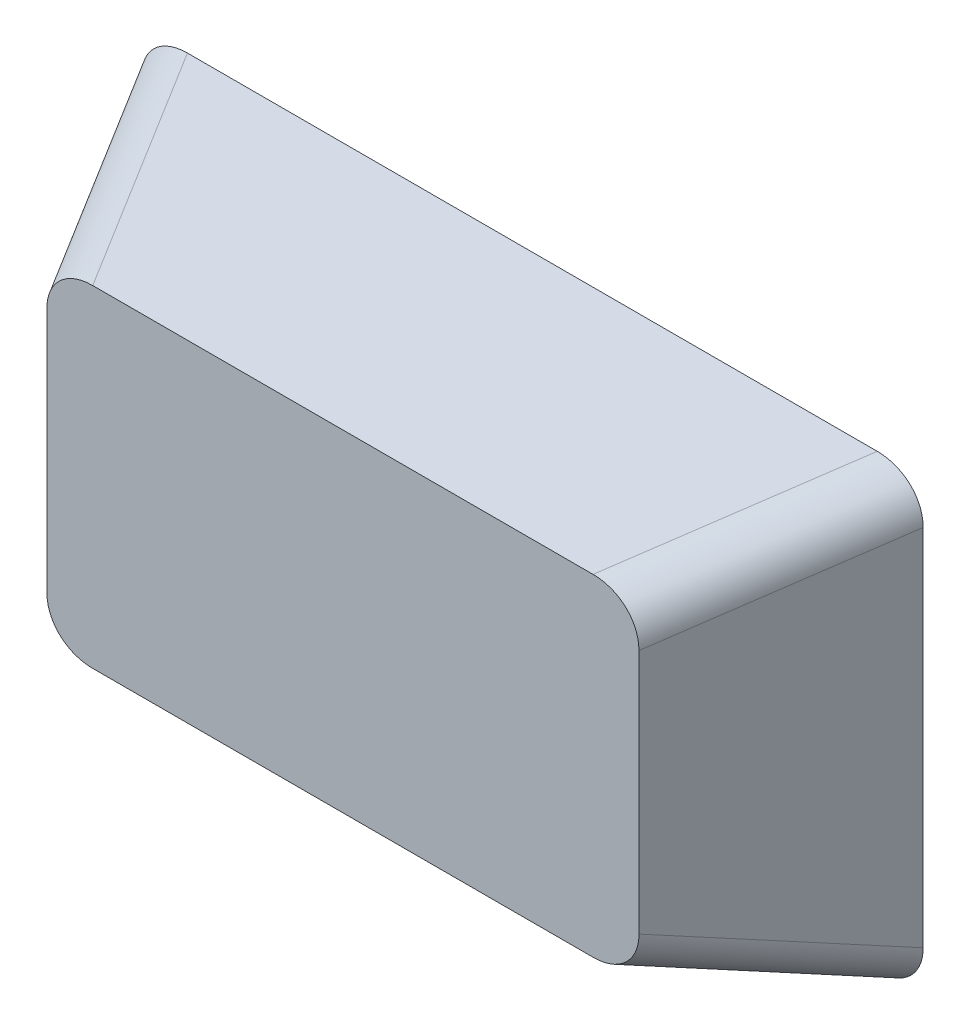
ISO-10303-21;
HEADER;
FILE_DESCRIPTION(('STEP AP214'),'2;1');
FILE_NAME('part.step','',(''),(''),'','','');
FILE_SCHEMA(('AUTOMOTIVE_DESIGN { 1 0 10303 214 1 1 1 1 }'));
ENDSEC;
DATA;
#1=APPLICATION_CONTEXT('core data for automotive mechanical design processes');
#2=APPLICATION_PROTOCOL_DEFINITION('international standard','automotive_design',2000,#1);
#3=PRODUCT_CONTEXT('',#1,'mechanical');
#4=PRODUCT('Part','Part','',(#3));
#5=PRODUCT_RELATED_PRODUCT_CATEGORY('part','',(#4));
#6=PRODUCT_DEFINITION_FORMATION('','',#4);
#7=PRODUCT_DEFINITION_CONTEXT('part definition',#1,'design');
#8=PRODUCT_DEFINITION('design','',#6,#7);
#9=PRODUCT_DEFINITION_SHAPE('','',#8);
#10=(LENGTH_UNIT() NAMED_UNIT(*) SI_UNIT(.MILLI.,.METRE.));
#11=(NAMED_UNIT(*) PLANE_ANGLE_UNIT() SI_UNIT($,.RADIAN.));
#12=(NAMED_UNIT(*) SI_UNIT($,.STERADIAN.) SOLID_ANGLE_UNIT());
#13=UNCERTAINTY_MEASURE_WITH_UNIT(LENGTH_MEASURE(1.E-05),#10,'distance_accuracy_value','');
#14=(GEOMETRIC_REPRESENTATION_CONTEXT(3) GLOBAL_UNCERTAINTY_ASSIGNED_CONTEXT((#13)) GLOBAL_UNIT_ASSIGNED_CONTEXT((#10,
#11,#12)) REPRESENTATION_CONTEXT('',''));
#15=CARTESIAN_POINT('',(0.,0.,0.));
#16=DIRECTION('',(0.,0.,1.));
#17=DIRECTION('',(1.,0.,0.));
#18=AXIS2_PLACEMENT_3D('',#15,#16,#17);
#19=CARTESIAN_POINT('',(0.,0.,-40.));
#20=DIRECTION('',(0.,0.,1.));
#21=DIRECTION('',(1.,0.,0.));
#22=AXIS2_PLACEMENT_3D('',#19,#20,#21);
#23=PLANE('',#22);
#24=DIRECTION('',(1.,0.,0.));
#25=VECTOR('',#24,1.);
#26=CARTESIAN_POINT('',(82.5,-47.5,-40.));
#27=LINE('',#26,#25);
#28=CARTESIAN_POINT('',(-72.8110350781808,-47.5,-40.));
#29=VERTEX_POINT('',#28);
#30=CARTESIAN_POINT('',(72.8110350781808,-47.5,-40.));
#31=VERTEX_POINT('',#30);
#32=EDGE_CURVE('E411',#29,#31,#27,.T.);
#33=ORIENTED_EDGE('',*,*,#32,.F.);
#34=CARTESIAN_POINT('',(-71.319660112501,-37.0230908660999,-40.));
#35=DIRECTION('',(0.,0.,1.));
#36=DIRECTION('',(-0.847998304005088,-0.52999894000318,0.));
#37=AXIS2_PLACEMENT_3D('',#34,#35,#36);
#38=ELLIPSE('',#37,11.6088597631292,10.);
#39=CARTESIAN_POINT('',(-82.5,-38.4206333520372,-40.));
#40=VERTEX_POINT('',#39);
#41=EDGE_CURVE('E443',#29,#40,#38,.F.);
#42=ORIENTED_EDGE('',*,*,#41,.T.);
#43=DIRECTION('',(0.,-1.,0.));
#44=VECTOR('',#43,1.);
#45=CARTESIAN_POINT('',(-82.5,-47.5,-40.));
#46=LINE('',#45,#44);
#47=CARTESIAN_POINT('',(-82.5,38.4206333520372,-40.));
#48=VERTEX_POINT('',#47);
#49=EDGE_CURVE('E376',#48,#40,#46,.T.);
#50=ORIENTED_EDGE('',*,*,#49,.F.);
#51=CARTESIAN_POINT('',(-71.319660112501,37.0230908660999,-40.));
#52=DIRECTION('',(0.,0.,1.));
#53=DIRECTION('',(-0.847998304005088,0.52999894000318,0.));
#54=AXIS2_PLACEMENT_3D('',#51,#52,#53);
#55=ELLIPSE('',#54,11.6088597631292,10.);
#56=CARTESIAN_POINT('',(-72.8110350781808,47.5,-40.));
#57=VERTEX_POINT('',#56);
#58=EDGE_CURVE('E482',#48,#57,#55,.F.);
#59=ORIENTED_EDGE('',*,*,#58,.T.);
#60=DIRECTION('',(-1.,0.,0.));
#61=VECTOR('',#60,1.);
#62=CARTESIAN_POINT('',(82.5,47.5,-40.));
#63=LINE('',#62,#61);
#64=CARTESIAN_POINT('',(72.8110350781808,47.5,-40.));
#65=VERTEX_POINT('',#64);
#66=EDGE_CURVE('E384',#65,#57,#63,.T.);
#67=ORIENTED_EDGE('',*,*,#66,.F.);
#68=CARTESIAN_POINT('',(71.319660112501,37.0230908660999,-40.));
#69=DIRECTION('',(0.,0.,1.));
#70=DIRECTION('',(0.847998304005088,0.52999894000318,0.));
#71=AXIS2_PLACEMENT_3D('',#68,#69,#70);
#72=ELLIPSE('',#71,11.6088597631292,10.);
#73=CARTESIAN_POINT('',(82.5,38.4206333520372,-40.));
#74=VERTEX_POINT('',#73);
#75=EDGE_CURVE('E480',#65,#74,#72,.F.);
#76=ORIENTED_EDGE('',*,*,#75,.T.);
#77=DIRECTION('',(0.,1.,0.));
#78=VECTOR('',#77,1.);
#79=CARTESIAN_POINT('',(82.5,-47.5,-40.));
#80=LINE('',#79,#78);
#81=CARTESIAN_POINT('',(82.5,-38.4206333520372,-40.));
#82=VERTEX_POINT('',#81);
#83=EDGE_CURVE('E390',#82,#74,#80,.T.);
#84=ORIENTED_EDGE('',*,*,#83,.F.);
#85=CARTESIAN_POINT('',(71.319660112501,-37.0230908660999,-40.));
#86=DIRECTION('',(0.,0.,1.));
#87=DIRECTION('',(0.847998304005088,-0.52999894000318,0.));
#88=AXIS2_PLACEMENT_3D('',#85,#86,#87);
#89=ELLIPSE('',#88,11.6088597631292,10.);
#90=EDGE_CURVE('E481',#82,#31,#89,.F.);
#91=ORIENTED_EDGE('',*,*,#90,.T.);
#92=EDGE_LOOP('',(#33,#42,#50,#59,#67,#76,#84,#91));
#93=FACE_BOUND('',#92,.T.);
#94=DIRECTION('',(1.,0.,0.));
#95=VECTOR('',#94,1.);
#96=CARTESIAN_POINT('',(77.5,-42.5,-40.));
#97=LINE('',#96,#95);
#98=CARTESIAN_POINT('',(-77.5,-42.5,-40.));
#99=VERTEX_POINT('',#98);
#100=CARTESIAN_POINT('',(77.5,-42.5,-40.));
#101=VERTEX_POINT('',#100);
#102=EDGE_CURVE('E152',#99,#101,#97,.T.);
#103=ORIENTED_EDGE('',*,*,#102,.T.);
#104=DIRECTION('',(0.,1.,0.));
#105=VECTOR('',#104,1.);
#106=CARTESIAN_POINT('',(77.5,-42.5,-40.));
#107=LINE('',#106,#105);
#108=CARTESIAN_POINT('',(77.5,42.5,-40.));
#109=VERTEX_POINT('',#108);
#110=EDGE_CURVE('E163',#101,#109,#107,.T.);
#111=ORIENTED_EDGE('',*,*,#110,.T.);
#112=DIRECTION('',(-1.,0.,0.));
#113=VECTOR('',#112,1.);
#114=CARTESIAN_POINT('',(77.5,42.5,-40.));
#115=LINE('',#114,#113);
#116=CARTESIAN_POINT('',(-77.5,42.5,-40.));
#117=VERTEX_POINT('',#116);
#118=EDGE_CURVE('E172',#109,#117,#115,.T.);
#119=ORIENTED_EDGE('',*,*,#118,.T.);
#120=DIRECTION('',(0.,-1.,0.));
#121=VECTOR('',#120,1.);
#122=CARTESIAN_POINT('',(-77.5,-42.5,-40.));
#123=LINE('',#122,#121);
#124=EDGE_CURVE('E178',#117,#99,#123,.T.);
#125=ORIENTED_EDGE('',*,*,#124,.T.);
#126=EDGE_LOOP('',(#103,#111,#119,#125));
#127=FACE_BOUND('',#126,.T.);
#128=ADVANCED_FACE('F55',(#93,#127),#23,.F.);
#129=CARTESIAN_POINT('',(0.,0.,0.));
#130=DIRECTION('',(0.,0.,1.));
#131=DIRECTION('',(1.,0.,0.));
#132=AXIS2_PLACEMENT_3D('',#129,#130,#131);
#133=PLANE('',#132);
#134=DIRECTION('',(0.,-1.,0.));
#135=VECTOR('',#134,1.);
#136=CARTESIAN_POINT('',(-62.5,-35.,0.));
#137=LINE('',#136,#135);
#138=CARTESIAN_POINT('',(-62.5,25.9206333520372,0.));
#139=VERTEX_POINT('',#138);
#140=CARTESIAN_POINT('',(-62.5,-25.9206333520372,0.));
#141=VERTEX_POINT('',#140);
#142=EDGE_CURVE('E267',#139,#141,#137,.T.);
#143=ORIENTED_EDGE('',*,*,#142,.T.);
#144=CARTESIAN_POINT('',(-51.319660112501,-24.5230908660999,0.));
#145=DIRECTION('',(0.,0.,1.));
#146=DIRECTION('',(-0.847998304005088,-0.52999894000318,0.));
#147=AXIS2_PLACEMENT_3D('',#144,#145,#146);
#148=ELLIPSE('',#147,11.6088597631292,10.);
#149=CARTESIAN_POINT('',(-52.8110350781808,-35.,0.));
#150=VERTEX_POINT('',#149);
#151=EDGE_CURVE('E492',#141,#150,#148,.T.);
#152=ORIENTED_EDGE('',*,*,#151,.T.);
#153=DIRECTION('',(1.,0.,0.));
#154=VECTOR('',#153,1.);
#155=CARTESIAN_POINT('',(62.5,-35.,0.));
#156=LINE('',#155,#154);
#157=CARTESIAN_POINT('',(52.8110350781808,-35.,0.));
#158=VERTEX_POINT('',#157);
#159=EDGE_CURVE('E406',#150,#158,#156,.T.);
#160=ORIENTED_EDGE('',*,*,#159,.T.);
#161=CARTESIAN_POINT('',(51.319660112501,-24.5230908660999,0.));
#162=DIRECTION('',(0.,0.,1.));
#163=DIRECTION('',(0.847998304005088,-0.52999894000318,0.));
#164=AXIS2_PLACEMENT_3D('',#161,#162,#163);
#165=ELLIPSE('',#164,11.6088597631292,10.);
#166=CARTESIAN_POINT('',(62.5,-25.9206333520372,0.));
#167=VERTEX_POINT('',#166);
#168=EDGE_CURVE('E606',#158,#167,#165,.T.);
#169=ORIENTED_EDGE('',*,*,#168,.T.);
#170=DIRECTION('',(0.,1.,0.));
#171=VECTOR('',#170,1.);
#172=CARTESIAN_POINT('',(62.5,-35.,0.));
#173=LINE('',#172,#171);
#174=CARTESIAN_POINT('',(62.5,25.9206333520372,0.));
#175=VERTEX_POINT('',#174);
#176=EDGE_CURVE('E410',#167,#175,#173,.T.);
#177=ORIENTED_EDGE('',*,*,#176,.T.);
#178=CARTESIAN_POINT('',(51.319660112501,24.5230908660999,0.));
#179=DIRECTION('',(0.,0.,1.));
#180=DIRECTION('',(0.847998304005088,0.52999894000318,0.));
#181=AXIS2_PLACEMENT_3D('',#178,#179,#180);
#182=ELLIPSE('',#181,11.6088597631292,10.);
#183=CARTESIAN_POINT('',(52.8110350781808,35.,0.));
#184=VERTEX_POINT('',#183);
#185=EDGE_CURVE('E80',#175,#184,#182,.T.);
#186=ORIENTED_EDGE('',*,*,#185,.T.);
#187=DIRECTION('',(-1.,0.,0.));
#188=VECTOR('',#187,1.);
#189=CARTESIAN_POINT('',(62.5,35.,0.));
#190=LINE('',#189,#188);
#191=CARTESIAN_POINT('',(-52.8110350781808,35.,0.));
#192=VERTEX_POINT('',#191);
#193=EDGE_CURVE('E59',#184,#192,#190,.T.);
#194=ORIENTED_EDGE('',*,*,#193,.T.);
#195=CARTESIAN_POINT('',(-51.319660112501,24.5230908660999,0.));
#196=DIRECTION('',(0.,0.,1.));
#197=DIRECTION('',(-0.847998304005088,0.52999894000318,0.));
#198=AXIS2_PLACEMENT_3D('',#195,#196,#197);
#199=ELLIPSE('',#198,11.6088597631292,10.);
#200=EDGE_CURVE('E608',#192,#139,#199,.T.);
#201=ORIENTED_EDGE('',*,*,#200,.T.);
#202=EDGE_LOOP('',(#143,#152,#160,#169,#177,#186,#194,#201));
#203=FACE_BOUND('',#202,.T.);
#204=ADVANCED_FACE('F199',(#203),#133,.T.);
#205=CARTESIAN_POINT('',(-50.,0.,25.));
#206=DIRECTION('',(-0.894427190999916,0.,0.447213595499958));
#207=DIRECTION('',(0.447213595499958,0.,0.894427190999916));
#208=AXIS2_PLACEMENT_3D('',#205,#206,#207);
#209=PLANE('',#208);
#210=ORIENTED_EDGE('',*,*,#49,.T.);
#211=DIRECTION('',(-0.430705521646533,-0.269190951029083,-0.861411043293065));
#212=VECTOR('',#211,1.);
#213=CARTESIAN_POINT('',(-47.9005062780247,-16.7959497758027,29.1989874439507));
#214=LINE('',#213,#212);
#215=EDGE_CURVE('E442',#40,#141,#214,.F.);
#216=ORIENTED_EDGE('',*,*,#215,.T.);
#217=ORIENTED_EDGE('',*,*,#142,.F.);
#218=DIRECTION('',(-0.430705521646533,0.269190951029083,-0.861411043293065));
#219=VECTOR('',#218,1.);
#220=CARTESIAN_POINT('',(-47.9005062780247,16.7959497758027,29.1989874439507));
#221=LINE('',#220,#219);
#222=EDGE_CURVE('E440',#139,#48,#221,.T.);
#223=ORIENTED_EDGE('',*,*,#222,.T.);
#224=EDGE_LOOP('',(#210,#216,#217,#223));
#225=FACE_BOUND('',#224,.T.);
#226=ADVANCED_FACE('F342',(#225),#209,.T.);
#227=CARTESIAN_POINT('',(0.,-31.8861209964413,9.9644128113879));
#228=DIRECTION('',(0.,-0.95447997803503,0.298274993135947));
#229=DIRECTION('',(0.,-0.298274993135947,-0.95447997803503));
#230=AXIS2_PLACEMENT_3D('',#227,#228,#229);
#231=PLANE('',#230);
#232=ORIENTED_EDGE('',*,*,#159,.F.);
#233=DIRECTION('',(-0.430705521646532,-0.269190951029083,-0.861411043293065));
#234=VECTOR('',#233,1.);
#235=CARTESIAN_POINT('',(-38.9562343680255,-26.340749556153,27.7096014203105));
#236=LINE('',#235,#234);
#237=EDGE_CURVE('E478',#150,#29,#236,.T.);
#238=ORIENTED_EDGE('',*,*,#237,.T.);
#239=ORIENTED_EDGE('',*,*,#32,.T.);
#240=DIRECTION('',(0.430705521646533,-0.269190951029083,-0.861411043293065));
#241=VECTOR('',#240,1.);
#242=CARTESIAN_POINT('',(38.9562343680255,-26.340749556153,27.7096014203105));
#243=LINE('',#242,#241);
#244=EDGE_CURVE('E476',#31,#158,#243,.F.);
#245=ORIENTED_EDGE('',*,*,#244,.T.);
#246=EDGE_LOOP('',(#232,#238,#239,#245));
#247=FACE_BOUND('',#246,.T.);
#248=ADVANCED_FACE('F333',(#247),#231,.T.);
#249=CARTESIAN_POINT('',(0.,31.8861209964413,9.9644128113879));
#250=DIRECTION('',(0.,0.95447997803503,0.298274993135947));
#251=DIRECTION('',(0.,-0.298274993135947,0.95447997803503));
#252=AXIS2_PLACEMENT_3D('',#249,#250,#251);
#253=PLANE('',#252);
#254=ORIENTED_EDGE('',*,*,#66,.T.);
#255=DIRECTION('',(-0.430705521646533,0.269190951029083,-0.861411043293065));
#256=VECTOR('',#255,1.);
#257=CARTESIAN_POINT('',(-38.9562343680255,26.340749556153,27.7096014203106));
#258=LINE('',#257,#256);
#259=EDGE_CURVE('E73',#57,#192,#258,.F.);
#260=ORIENTED_EDGE('',*,*,#259,.T.);
#261=ORIENTED_EDGE('',*,*,#193,.F.);
#262=DIRECTION('',(0.430705521646532,0.269190951029083,-0.861411043293065));
#263=VECTOR('',#262,1.);
#264=CARTESIAN_POINT('',(38.9562343680255,26.340749556153,27.7096014203106));
#265=LINE('',#264,#263);
#266=EDGE_CURVE('E605',#184,#65,#265,.T.);
#267=ORIENTED_EDGE('',*,*,#266,.T.);
#268=EDGE_LOOP('',(#254,#260,#261,#267));
#269=FACE_BOUND('',#268,.T.);
#270=ADVANCED_FACE('F341',(#269),#253,.T.);
#271=CARTESIAN_POINT('',(50.,0.,25.));
#272=DIRECTION('',(0.894427190999916,0.,0.447213595499958));
#273=DIRECTION('',(0.447213595499958,0.,-0.894427190999916));
#274=AXIS2_PLACEMENT_3D('',#271,#272,#273);
#275=PLANE('',#274);
#276=ORIENTED_EDGE('',*,*,#176,.F.);
#277=DIRECTION('',(0.430705521646533,-0.269190951029083,-0.861411043293065));
#278=VECTOR('',#277,1.);
#279=CARTESIAN_POINT('',(47.9005062780247,-16.7959497758027,29.1989874439507));
#280=LINE('',#279,#278);
#281=EDGE_CURVE('E12',#167,#82,#280,.T.);
#282=ORIENTED_EDGE('',*,*,#281,.T.);
#283=ORIENTED_EDGE('',*,*,#83,.T.);
#284=DIRECTION('',(0.430705521646533,0.269190951029083,-0.861411043293065));
#285=VECTOR('',#284,1.);
#286=CARTESIAN_POINT('',(47.9005062780247,16.7959497758027,29.1989874439507));
#287=LINE('',#286,#285);
#288=EDGE_CURVE('E65',#74,#175,#287,.F.);
#289=ORIENTED_EDGE('',*,*,#288,.T.);
#290=EDGE_LOOP('',(#276,#282,#283,#289));
#291=FACE_BOUND('',#290,.T.);
#292=ADVANCED_FACE('F201',(#291),#275,.T.);
#293=CARTESIAN_POINT('',(0.,0.,-20.));
#294=DIRECTION('',(0.,0.,1.));
#295=DIRECTION('',(1.,0.,0.));
#296=AXIS2_PLACEMENT_3D('',#293,#294,#295);
#297=PLANE('',#296);
#298=DIRECTION('',(0.,-1.,0.));
#299=VECTOR('',#298,1.);
#300=CARTESIAN_POINT('',(-22.5,-12.5,-20.));
#301=LINE('',#300,#299);
#302=CARTESIAN_POINT('',(-22.5,12.5,-20.));
#303=VERTEX_POINT('',#302);
#304=CARTESIAN_POINT('',(-22.5,-12.5,-20.));
#305=VERTEX_POINT('',#304);
#306=EDGE_CURVE('E262',#303,#305,#301,.T.);
#307=ORIENTED_EDGE('',*,*,#306,.F.);
#308=DIRECTION('',(-1.,0.,0.));
#309=VECTOR('',#308,1.);
#310=CARTESIAN_POINT('',(22.5,12.5,-20.));
#311=LINE('',#310,#309);
#312=CARTESIAN_POINT('',(22.5,12.5,-20.));
#313=VERTEX_POINT('',#312);
#314=EDGE_CURVE('E307',#313,#303,#311,.T.);
#315=ORIENTED_EDGE('',*,*,#314,.F.);
#316=DIRECTION('',(0.,1.,0.));
#317=VECTOR('',#316,1.);
#318=CARTESIAN_POINT('',(22.5,-12.5,-20.));
#319=LINE('',#318,#317);
#320=CARTESIAN_POINT('',(22.5,-12.5,-20.));
#321=VERTEX_POINT('',#320);
#322=EDGE_CURVE('E268',#321,#313,#319,.T.);
#323=ORIENTED_EDGE('',*,*,#322,.F.);
#324=DIRECTION('',(1.,0.,0.));
#325=VECTOR('',#324,1.);
#326=CARTESIAN_POINT('',(22.5,-12.5,-20.));
#327=LINE('',#326,#325);
#328=EDGE_CURVE('E156',#305,#321,#327,.T.);
#329=ORIENTED_EDGE('',*,*,#328,.F.);
#330=EDGE_LOOP('',(#307,#315,#323,#329));
#331=FACE_BOUND('',#330,.T.);
#332=ADVANCED_FACE('F280',(#331),#297,.F.);
#333=CARTESIAN_POINT('',(0.,5.38461538461539,-8.07692307692308));
#334=DIRECTION('',(0.,0.554700196225229,-0.832050294337844));
#335=DIRECTION('',(0.,0.832050294337844,0.554700196225229));
#336=AXIS2_PLACEMENT_3D('',#333,#334,#335);
#337=PLANE('',#336);
#338=DIRECTION('',(-0.836314513396676,0.456171552761824,0.304114368507882));
#339=VECTOR('',#338,1.);
#340=CARTESIAN_POINT('',(77.5,-42.5,-40.));
#341=LINE('',#340,#339);
#342=EDGE_CURVE('E148',#101,#321,#341,.T.);
#343=ORIENTED_EDGE('',*,*,#342,.F.);
#344=ORIENTED_EDGE('',*,*,#102,.F.);
#345=DIRECTION('',(0.836314513396676,0.456171552761824,0.304114368507882));
#346=VECTOR('',#345,1.);
#347=CARTESIAN_POINT('',(-77.5,-42.5,-40.));
#348=LINE('',#347,#346);
#349=EDGE_CURVE('E160',#99,#305,#348,.T.);
#350=ORIENTED_EDGE('',*,*,#349,.T.);
#351=ORIENTED_EDGE('',*,*,#328,.T.);
#352=EDGE_LOOP('',(#343,#344,#350,#351));
#353=FACE_BOUND('',#352,.T.);
#354=ADVANCED_FACE('F150',(#353),#337,.T.);
#355=CARTESIAN_POINT('',(3.7956204379562,0.,-10.4379562043796));
#356=DIRECTION('',(0.341743063086704,0.,-0.939793423488437));
#357=DIRECTION('',(-0.939793423488437,0.,-0.341743063086704));
#358=AXIS2_PLACEMENT_3D('',#355,#356,#357);
#359=PLANE('',#358);
#360=ORIENTED_EDGE('',*,*,#349,.F.);
#361=ORIENTED_EDGE('',*,*,#124,.F.);
#362=DIRECTION('',(0.836314513396676,-0.456171552761823,0.304114368507882));
#363=VECTOR('',#362,1.);
#364=CARTESIAN_POINT('',(-77.5,42.5,-40.));
#365=LINE('',#364,#363);
#366=EDGE_CURVE('E682',#117,#303,#365,.T.);
#367=ORIENTED_EDGE('',*,*,#366,.T.);
#368=ORIENTED_EDGE('',*,*,#306,.T.);
#369=EDGE_LOOP('',(#360,#361,#367,#368));
#370=FACE_BOUND('',#369,.T.);
#371=ADVANCED_FACE('F523',(#370),#359,.T.);
#372=CARTESIAN_POINT('',(-3.79562043795621,0.,-10.4379562043796));
#373=DIRECTION('',(-0.341743063086704,0.,-0.939793423488437));
#374=DIRECTION('',(-0.939793423488437,0.,0.341743063086704));
#375=AXIS2_PLACEMENT_3D('',#372,#373,#374);
#376=PLANE('',#375);
#377=DIRECTION('',(-0.836314513396676,-0.456171552761823,0.304114368507882));
#378=VECTOR('',#377,1.);
#379=CARTESIAN_POINT('',(77.5,42.5,-40.));
#380=LINE('',#379,#378);
#381=EDGE_CURVE('E167',#109,#313,#380,.T.);
#382=ORIENTED_EDGE('',*,*,#381,.F.);
#383=ORIENTED_EDGE('',*,*,#110,.F.);
#384=ORIENTED_EDGE('',*,*,#342,.T.);
#385=ORIENTED_EDGE('',*,*,#322,.T.);
#386=EDGE_LOOP('',(#382,#383,#384,#385));
#387=FACE_BOUND('',#386,.T.);
#388=ADVANCED_FACE('F165',(#387),#376,.T.);
#389=CARTESIAN_POINT('',(0.,-5.38461538461538,-8.07692307692308));
#390=DIRECTION('',(0.,-0.554700196225229,-0.832050294337844));
#391=DIRECTION('',(0.,0.832050294337844,-0.554700196225229));
#392=AXIS2_PLACEMENT_3D('',#389,#390,#391);
#393=PLANE('',#392);
#394=ORIENTED_EDGE('',*,*,#366,.F.);
#395=ORIENTED_EDGE('',*,*,#118,.F.);
#396=ORIENTED_EDGE('',*,*,#381,.T.);
#397=ORIENTED_EDGE('',*,*,#314,.T.);
#398=EDGE_LOOP('',(#394,#395,#396,#397));
#399=FACE_BOUND('',#398,.T.);
#400=ADVANCED_FACE('F290',(#399),#393,.T.);
#401=CARTESIAN_POINT('',(-38.9562343680255,-16.7959497758027,24.7268514889511));
#402=DIRECTION('',(-0.430705521646532,-0.269190951029083,-0.861411043293065));
#403=DIRECTION('',(-0.894427190999916,0.,0.447213595499958));
#404=AXIS2_PLACEMENT_3D('',#401,#402,#403);
#405=CYLINDRICAL_SURFACE('',#404,10.);
#406=ORIENTED_EDGE('',*,*,#151,.F.);
#407=ORIENTED_EDGE('',*,*,#215,.F.);
#408=ORIENTED_EDGE('',*,*,#41,.F.);
#409=ORIENTED_EDGE('',*,*,#237,.F.);
#410=EDGE_LOOP('',(#406,#407,#408,#409));
#411=FACE_BOUND('',#410,.T.);
#412=ADVANCED_FACE('F204',(#411),#405,.T.);
#413=CARTESIAN_POINT('',(-38.9562343680255,16.7959497758027,24.7268514889511));
#414=DIRECTION('',(-0.430705521646532,0.269190951029083,-0.861411043293065));
#415=DIRECTION('',(-0.894427190999916,0.,0.447213595499958));
#416=AXIS2_PLACEMENT_3D('',#413,#414,#415);
#417=CYLINDRICAL_SURFACE('',#416,10.);
#418=ORIENTED_EDGE('',*,*,#200,.F.);
#419=ORIENTED_EDGE('',*,*,#259,.F.);
#420=ORIENTED_EDGE('',*,*,#58,.F.);
#421=ORIENTED_EDGE('',*,*,#222,.F.);
#422=EDGE_LOOP('',(#418,#419,#420,#421));
#423=FACE_BOUND('',#422,.T.);
#424=ADVANCED_FACE('F576',(#423),#417,.T.);
#425=CARTESIAN_POINT('',(38.9562343680255,-16.7959497758027,24.7268514889511));
#426=DIRECTION('',(0.430705521646532,-0.269190951029083,-0.861411043293065));
#427=DIRECTION('',(-0.894427190999916,0.,-0.447213595499958));
#428=AXIS2_PLACEMENT_3D('',#425,#426,#427);
#429=CYLINDRICAL_SURFACE('',#428,10.);
#430=ORIENTED_EDGE('',*,*,#168,.F.);
#431=ORIENTED_EDGE('',*,*,#244,.F.);
#432=ORIENTED_EDGE('',*,*,#90,.F.);
#433=ORIENTED_EDGE('',*,*,#281,.F.);
#434=EDGE_LOOP('',(#430,#431,#432,#433));
#435=FACE_BOUND('',#434,.T.);
#436=ADVANCED_FACE('F584',(#435),#429,.T.);
#437=CARTESIAN_POINT('',(38.9562343680255,16.7959497758027,24.7268514889511));
#438=DIRECTION('',(0.430705521646532,0.269190951029083,-0.861411043293065));
#439=DIRECTION('',(-0.894427190999916,0.,-0.447213595499958));
#440=AXIS2_PLACEMENT_3D('',#437,#438,#439);
#441=CYLINDRICAL_SURFACE('',#440,10.);
#442=ORIENTED_EDGE('',*,*,#185,.F.);
#443=ORIENTED_EDGE('',*,*,#288,.F.);
#444=ORIENTED_EDGE('',*,*,#75,.F.);
#445=ORIENTED_EDGE('',*,*,#266,.F.);
#446=EDGE_LOOP('',(#442,#443,#444,#445));
#447=FACE_BOUND('',#446,.T.);
#448=ADVANCED_FACE('F57',(#447),#441,.T.);
#449=CLOSED_SHELL('',(#128,#204,#226,#248,#270,#292,#332,#354,#371,#388,#400,#412,#424,#436,#448));
#450=MANIFOLD_SOLID_BREP('B2',#449);
#451=ADVANCED_BREP_SHAPE_REPRESENTATION('',(#18,#450),#14);
#452=SHAPE_DEFINITION_REPRESENTATION(#9,#451);
ENDSEC;
END-ISO-10303-21;
